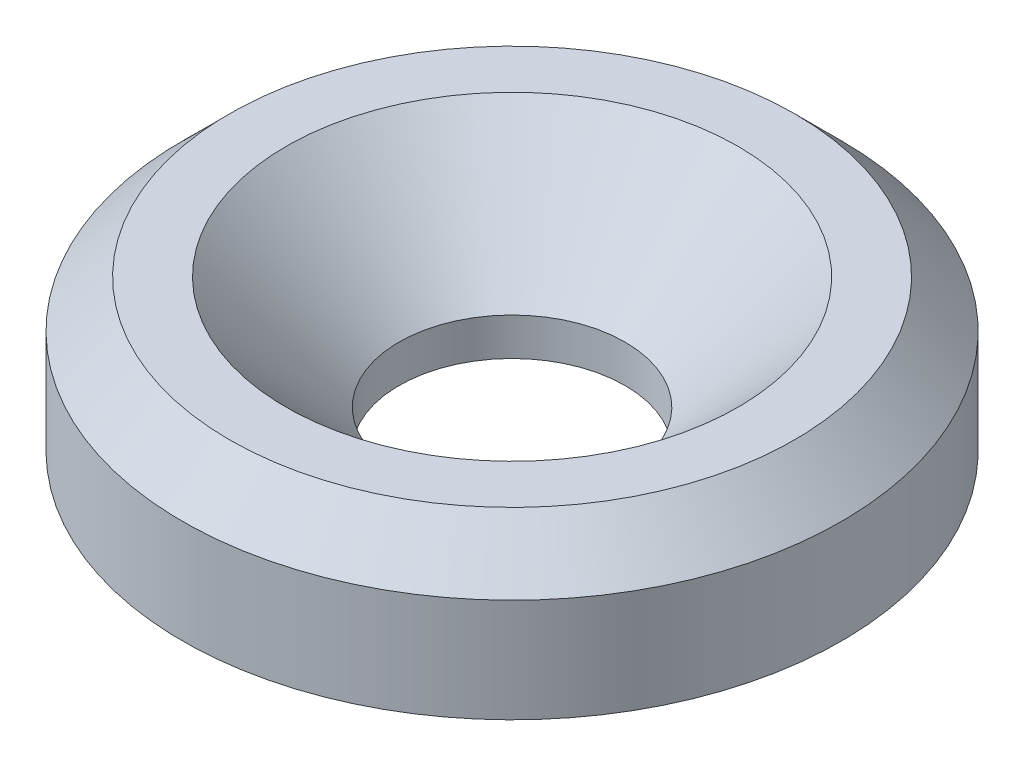
ISO-10303-21;
HEADER;
FILE_DESCRIPTION(('STEP AP214'),'2;1');
FILE_NAME('part.step','',(''),(''),'','','');
FILE_SCHEMA(('AUTOMOTIVE_DESIGN { 1 0 10303 214 1 1 1 1 }'));
ENDSEC;
DATA;
#1=APPLICATION_CONTEXT('core data for automotive mechanical design processes');
#2=APPLICATION_PROTOCOL_DEFINITION('international standard','automotive_design',2000,#1);
#3=PRODUCT_CONTEXT('',#1,'mechanical');
#4=PRODUCT('Part','Part','',(#3));
#5=PRODUCT_RELATED_PRODUCT_CATEGORY('part','',(#4));
#6=PRODUCT_DEFINITION_FORMATION('','',#4);
#7=PRODUCT_DEFINITION_CONTEXT('part definition',#1,'design');
#8=PRODUCT_DEFINITION('design','',#6,#7);
#9=PRODUCT_DEFINITION_SHAPE('','',#8);
#10=(LENGTH_UNIT() NAMED_UNIT(*) SI_UNIT(.MILLI.,.METRE.));
#11=(NAMED_UNIT(*) PLANE_ANGLE_UNIT() SI_UNIT($,.RADIAN.));
#12=(NAMED_UNIT(*) SI_UNIT($,.STERADIAN.) SOLID_ANGLE_UNIT());
#13=UNCERTAINTY_MEASURE_WITH_UNIT(LENGTH_MEASURE(1.E-05),#10,'distance_accuracy_value','');
#14=(GEOMETRIC_REPRESENTATION_CONTEXT(3) GLOBAL_UNCERTAINTY_ASSIGNED_CONTEXT((#13)) GLOBAL_UNIT_ASSIGNED_CONTEXT((#10,
#11,#12)) REPRESENTATION_CONTEXT('',''));
#15=CARTESIAN_POINT('',(0.,0.,0.));
#16=DIRECTION('',(0.,0.,1.));
#17=DIRECTION('',(1.,0.,0.));
#18=AXIS2_PLACEMENT_3D('',#15,#16,#17);
#19=CARTESIAN_POINT('',(0.,0.,0.));
#20=DIRECTION('',(0.,-1.,0.));
#21=DIRECTION('',(0.,0.,-1.));
#22=AXIS2_PLACEMENT_3D('',#19,#20,#21);
#23=CYLINDRICAL_SURFACE('',#22,6.);
#24=CARTESIAN_POINT('',(0.,0.,0.));
#25=DIRECTION('',(0.,-1.,0.));
#26=DIRECTION('',(0.,0.,-1.));
#27=AXIS2_PLACEMENT_3D('',#24,#25,#26);
#28=CIRCLE('',#27,6.);
#29=CARTESIAN_POINT('',(0.,0.,-6.));
#30=VERTEX_POINT('',#29);
#31=EDGE_CURVE('E10',#30,#30,#28,.T.);
#32=ORIENTED_EDGE('',*,*,#31,.T.);
#33=EDGE_LOOP('',(#32));
#34=FACE_BOUND('',#33,.T.);
#35=CARTESIAN_POINT('',(0.,2.,0.));
#36=DIRECTION('',(0.,-1.,0.));
#37=DIRECTION('',(0.,0.,-1.));
#38=AXIS2_PLACEMENT_3D('',#35,#36,#37);
#39=CIRCLE('',#38,6.);
#40=CARTESIAN_POINT('',(0.,2.,-6.));
#41=VERTEX_POINT('',#40);
#42=EDGE_CURVE('E61',#41,#41,#39,.T.);
#43=ORIENTED_EDGE('',*,*,#42,.F.);
#44=EDGE_LOOP('',(#43));
#45=FACE_BOUND('',#44,.T.);
#46=ADVANCED_FACE('F39',(#34,#45),#23,.F.);
#47=CARTESIAN_POINT('',(6.,0.,0.));
#48=DIRECTION('',(0.,-1.,0.));
#49=DIRECTION('',(0.,0.,-1.));
#50=AXIS2_PLACEMENT_3D('',#47,#48,#49);
#51=PLANE('',#50);
#52=CARTESIAN_POINT('',(0.,0.,0.));
#53=DIRECTION('',(0.,-1.,0.));
#54=DIRECTION('',(0.,0.,-1.));
#55=AXIS2_PLACEMENT_3D('',#52,#53,#54);
#56=CIRCLE('',#55,17.5);
#57=CARTESIAN_POINT('',(0.,0.,-17.5));
#58=VERTEX_POINT('',#57);
#59=EDGE_CURVE('E45',#58,#58,#56,.T.);
#60=ORIENTED_EDGE('',*,*,#59,.T.);
#61=EDGE_LOOP('',(#60));
#62=FACE_BOUND('',#61,.T.);
#63=ORIENTED_EDGE('',*,*,#31,.F.);
#64=EDGE_LOOP('',(#63));
#65=FACE_BOUND('',#64,.T.);
#66=ADVANCED_FACE('F69',(#62,#65),#51,.T.);
#67=CARTESIAN_POINT('',(0.,0.,0.));
#68=DIRECTION('',(0.,-1.,0.));
#69=DIRECTION('',(0.,0.,-1.));
#70=AXIS2_PLACEMENT_3D('',#67,#68,#69);
#71=CYLINDRICAL_SURFACE('',#70,17.5);
#72=CARTESIAN_POINT('',(0.,5.5,0.));
#73=DIRECTION('',(0.,-1.,0.));
#74=DIRECTION('',(0.,0.,-1.));
#75=AXIS2_PLACEMENT_3D('',#72,#73,#74);
#76=CIRCLE('',#75,17.5);
#77=CARTESIAN_POINT('',(0.,5.5,-17.5));
#78=VERTEX_POINT('',#77);
#79=EDGE_CURVE('E49',#78,#78,#76,.T.);
#80=ORIENTED_EDGE('',*,*,#79,.T.);
#81=EDGE_LOOP('',(#80));
#82=FACE_BOUND('',#81,.T.);
#83=ORIENTED_EDGE('',*,*,#59,.F.);
#84=EDGE_LOOP('',(#83));
#85=FACE_BOUND('',#84,.T.);
#86=ADVANCED_FACE('F73',(#82,#85),#71,.T.);
#87=CARTESIAN_POINT('',(0.,5.5,0.));
#88=DIRECTION('',(0.,-1.,0.));
#89=DIRECTION('',(0.,0.,-1.));
#90=AXIS2_PLACEMENT_3D('',#87,#88,#89);
#91=CONICAL_SURFACE('',#90,17.5,0.78539816339745);
#92=CARTESIAN_POINT('',(0.,8.,0.));
#93=DIRECTION('',(0.,-1.,0.));
#94=DIRECTION('',(0.,0.,-1.));
#95=AXIS2_PLACEMENT_3D('',#92,#93,#94);
#96=CIRCLE('',#95,15.);
#97=CARTESIAN_POINT('',(0.,8.,-15.));
#98=VERTEX_POINT('',#97);
#99=EDGE_CURVE('E53',#98,#98,#96,.T.);
#100=ORIENTED_EDGE('',*,*,#99,.T.);
#101=EDGE_LOOP('',(#100));
#102=FACE_BOUND('',#101,.T.);
#103=ORIENTED_EDGE('',*,*,#79,.F.);
#104=EDGE_LOOP('',(#103));
#105=FACE_BOUND('',#104,.T.);
#106=ADVANCED_FACE('F77',(#102,#105),#91,.T.);
#107=CARTESIAN_POINT('',(15.,8.,0.));
#108=DIRECTION('',(0.,1.,0.));
#109=DIRECTION('',(0.,0.,1.));
#110=AXIS2_PLACEMENT_3D('',#107,#108,#109);
#111=PLANE('',#110);
#112=CARTESIAN_POINT('',(0.,8.,0.));
#113=DIRECTION('',(0.,-1.,0.));
#114=DIRECTION('',(0.,0.,-1.));
#115=AXIS2_PLACEMENT_3D('',#112,#113,#114);
#116=CIRCLE('',#115,11.9999999999999);
#117=CARTESIAN_POINT('',(0.,8.,-11.9999999999999));
#118=VERTEX_POINT('',#117);
#119=EDGE_CURVE('E58',#118,#118,#116,.T.);
#120=ORIENTED_EDGE('',*,*,#119,.T.);
#121=EDGE_LOOP('',(#120));
#122=FACE_BOUND('',#121,.T.);
#123=ORIENTED_EDGE('',*,*,#99,.F.);
#124=EDGE_LOOP('',(#123));
#125=FACE_BOUND('',#124,.T.);
#126=ADVANCED_FACE('F84',(#122,#125),#111,.T.);
#127=CARTESIAN_POINT('',(0.,8.,0.));
#128=DIRECTION('',(0.,1.,0.));
#129=DIRECTION('',(0.,0.,1.));
#130=AXIS2_PLACEMENT_3D('',#127,#128,#129);
#131=CONICAL_SURFACE('',#130,11.9999999999999,0.785398163397443);
#132=ORIENTED_EDGE('',*,*,#42,.T.);
#133=EDGE_LOOP('',(#132));
#134=FACE_BOUND('',#133,.T.);
#135=ORIENTED_EDGE('',*,*,#119,.F.);
#136=EDGE_LOOP('',(#135));
#137=FACE_BOUND('',#136,.T.);
#138=ADVANCED_FACE('F65',(#134,#137),#131,.F.);
#139=CLOSED_SHELL('',(#46,#66,#86,#106,#126,#138));
#140=MANIFOLD_SOLID_BREP('B2',#139);
#141=ADVANCED_BREP_SHAPE_REPRESENTATION('',(#18,#140),#14);
#142=SHAPE_DEFINITION_REPRESENTATION(#9,#141);
ENDSEC;
END-ISO-10303-21;
